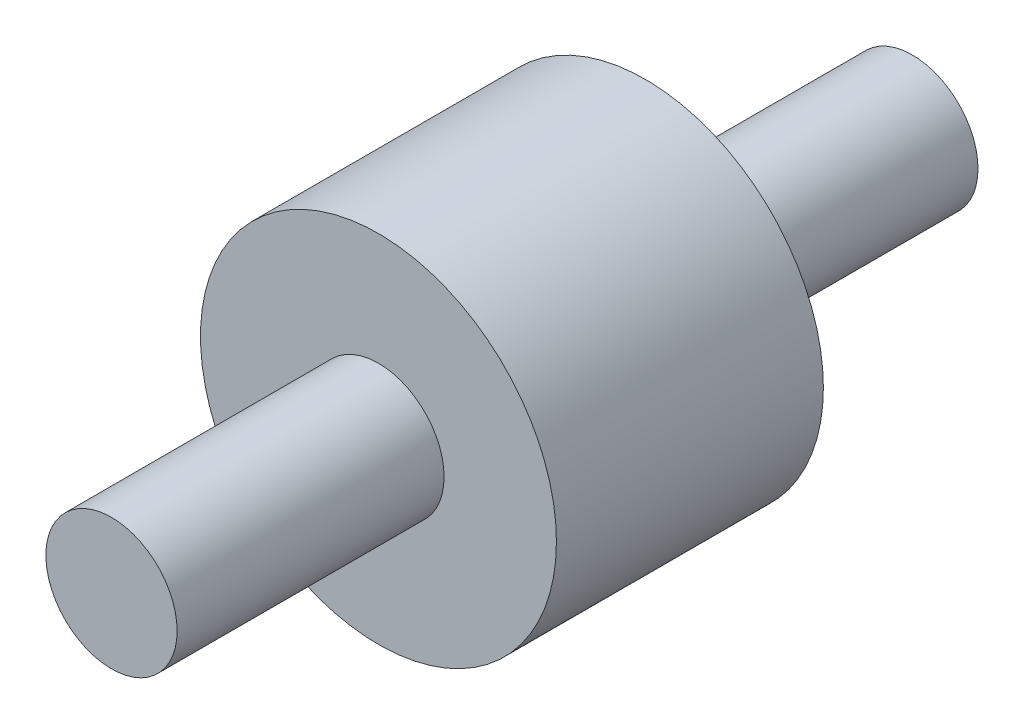
ISO-10303-21;
HEADER;
FILE_DESCRIPTION(('STEP AP214'),'2;1');
FILE_NAME('part.step','',(''),(''),'','','');
FILE_SCHEMA(('AUTOMOTIVE_DESIGN { 1 0 10303 214 1 1 1 1 }'));
ENDSEC;
DATA;
#1=APPLICATION_CONTEXT('core data for automotive mechanical design processes');
#2=APPLICATION_PROTOCOL_DEFINITION('international standard','automotive_design',2000,#1);
#3=PRODUCT_CONTEXT('',#1,'mechanical');
#4=PRODUCT('Part','Part','',(#3));
#5=PRODUCT_RELATED_PRODUCT_CATEGORY('part','',(#4));
#6=PRODUCT_DEFINITION_FORMATION('','',#4);
#7=PRODUCT_DEFINITION_CONTEXT('part definition',#1,'design');
#8=PRODUCT_DEFINITION('design','',#6,#7);
#9=PRODUCT_DEFINITION_SHAPE('','',#8);
#10=(LENGTH_UNIT() NAMED_UNIT(*) SI_UNIT(.MILLI.,.METRE.));
#11=(NAMED_UNIT(*) PLANE_ANGLE_UNIT() SI_UNIT($,.RADIAN.));
#12=(NAMED_UNIT(*) SI_UNIT($,.STERADIAN.) SOLID_ANGLE_UNIT());
#13=UNCERTAINTY_MEASURE_WITH_UNIT(LENGTH_MEASURE(1.E-05),#10,'distance_accuracy_value','');
#14=(GEOMETRIC_REPRESENTATION_CONTEXT(3) GLOBAL_UNCERTAINTY_ASSIGNED_CONTEXT((#13)) GLOBAL_UNIT_ASSIGNED_CONTEXT((#10,
#11,#12)) REPRESENTATION_CONTEXT('',''));
#15=CARTESIAN_POINT('',(0.,0.,0.));
#16=DIRECTION('',(0.,0.,1.));
#17=DIRECTION('',(1.,0.,0.));
#18=AXIS2_PLACEMENT_3D('',#15,#16,#17);
#19=CARTESIAN_POINT('',(0.,0.,6.));
#20=DIRECTION('',(0.,0.,-1.));
#21=DIRECTION('',(-1.,0.,0.));
#22=AXIS2_PLACEMENT_3D('',#19,#20,#21);
#23=CYLINDRICAL_SURFACE('',#22,8.);
#24=CARTESIAN_POINT('',(0.,0.,6.));
#25=DIRECTION('',(0.,0.,1.));
#26=DIRECTION('',(1.,0.,0.));
#27=AXIS2_PLACEMENT_3D('',#24,#25,#26);
#28=CIRCLE('',#27,8.);
#29=CARTESIAN_POINT('',(8.,0.,6.));
#30=VERTEX_POINT('',#29);
#31=EDGE_CURVE('E45',#30,#30,#28,.T.);
#32=ORIENTED_EDGE('',*,*,#31,.F.);
#33=EDGE_LOOP('',(#32));
#34=FACE_BOUND('',#33,.T.);
#35=CARTESIAN_POINT('',(0.,0.,-6.));
#36=DIRECTION('',(0.,0.,1.));
#37=DIRECTION('',(1.,0.,0.));
#38=AXIS2_PLACEMENT_3D('',#35,#36,#37);
#39=CIRCLE('',#38,8.);
#40=CARTESIAN_POINT('',(8.,0.,-6.));
#41=VERTEX_POINT('',#40);
#42=EDGE_CURVE('E40',#41,#41,#39,.T.);
#43=ORIENTED_EDGE('',*,*,#42,.T.);
#44=EDGE_LOOP('',(#43));
#45=FACE_BOUND('',#44,.T.);
#46=ADVANCED_FACE('F37',(#34,#45),#23,.T.);
#47=CARTESIAN_POINT('',(0.,0.,6.));
#48=DIRECTION('',(0.,0.,1.));
#49=DIRECTION('',(1.,0.,0.));
#50=AXIS2_PLACEMENT_3D('',#47,#48,#49);
#51=PLANE('',#50);
#52=CARTESIAN_POINT('',(0.,0.,6.));
#53=DIRECTION('',(0.,0.,1.));
#54=DIRECTION('',(1.,0.,0.));
#55=AXIS2_PLACEMENT_3D('',#52,#53,#54);
#56=CIRCLE('',#55,2.95);
#57=CARTESIAN_POINT('',(2.95,0.,6.));
#58=VERTEX_POINT('',#57);
#59=EDGE_CURVE('E10',#58,#58,#56,.T.);
#60=ORIENTED_EDGE('',*,*,#59,.F.);
#61=EDGE_LOOP('',(#60));
#62=FACE_BOUND('',#61,.T.);
#63=ORIENTED_EDGE('',*,*,#31,.T.);
#64=EDGE_LOOP('',(#63));
#65=FACE_BOUND('',#64,.T.);
#66=ADVANCED_FACE('F77',(#62,#65),#51,.T.);
#67=CARTESIAN_POINT('',(0.,0.,-6.));
#68=DIRECTION('',(0.,0.,1.));
#69=DIRECTION('',(1.,0.,0.));
#70=AXIS2_PLACEMENT_3D('',#67,#68,#69);
#71=PLANE('',#70);
#72=CARTESIAN_POINT('',(0.,0.,-6.));
#73=DIRECTION('',(0.,0.,1.));
#74=DIRECTION('',(1.,0.,0.));
#75=AXIS2_PLACEMENT_3D('',#72,#73,#74);
#76=CIRCLE('',#75,2.95);
#77=CARTESIAN_POINT('',(2.95,0.,-6.));
#78=VERTEX_POINT('',#77);
#79=EDGE_CURVE('E57',#78,#78,#76,.T.);
#80=ORIENTED_EDGE('',*,*,#79,.T.);
#81=EDGE_LOOP('',(#80));
#82=FACE_BOUND('',#81,.T.);
#83=ORIENTED_EDGE('',*,*,#42,.F.);
#84=EDGE_LOOP('',(#83));
#85=FACE_BOUND('',#84,.T.);
#86=ADVANCED_FACE('F82',(#82,#85),#71,.F.);
#87=CARTESIAN_POINT('',(0.,0.,18.));
#88=DIRECTION('',(0.,0.,-1.));
#89=DIRECTION('',(-1.,0.,0.));
#90=AXIS2_PLACEMENT_3D('',#87,#88,#89);
#91=CYLINDRICAL_SURFACE('',#90,2.95);
#92=CARTESIAN_POINT('',(0.,0.,18.));
#93=DIRECTION('',(0.,0.,1.));
#94=DIRECTION('',(1.,0.,0.));
#95=AXIS2_PLACEMENT_3D('',#92,#93,#94);
#96=CIRCLE('',#95,2.95);
#97=CARTESIAN_POINT('',(2.95,0.,18.));
#98=VERTEX_POINT('',#97);
#99=EDGE_CURVE('E52',#98,#98,#96,.T.);
#100=ORIENTED_EDGE('',*,*,#99,.F.);
#101=EDGE_LOOP('',(#100));
#102=FACE_BOUND('',#101,.T.);
#103=ORIENTED_EDGE('',*,*,#59,.T.);
#104=EDGE_LOOP('',(#103));
#105=FACE_BOUND('',#104,.T.);
#106=ADVANCED_FACE('F92',(#102,#105),#91,.T.);
#107=CARTESIAN_POINT('',(0.,0.,18.));
#108=DIRECTION('',(0.,0.,1.));
#109=DIRECTION('',(1.,0.,0.));
#110=AXIS2_PLACEMENT_3D('',#107,#108,#109);
#111=PLANE('',#110);
#112=ORIENTED_EDGE('',*,*,#99,.T.);
#113=EDGE_LOOP('',(#112));
#114=FACE_BOUND('',#113,.T.);
#115=ADVANCED_FACE('F74',(#114),#111,.T.);
#116=CARTESIAN_POINT('',(0.,0.,-18.));
#117=DIRECTION('',(0.,0.,1.));
#118=DIRECTION('',(1.,0.,0.));
#119=AXIS2_PLACEMENT_3D('',#116,#117,#118);
#120=CYLINDRICAL_SURFACE('',#119,2.95);
#121=CARTESIAN_POINT('',(0.,0.,-18.));
#122=DIRECTION('',(0.,0.,1.));
#123=DIRECTION('',(1.,0.,0.));
#124=AXIS2_PLACEMENT_3D('',#121,#122,#123);
#125=CIRCLE('',#124,2.95);
#126=CARTESIAN_POINT('',(2.95,0.,-18.));
#127=VERTEX_POINT('',#126);
#128=EDGE_CURVE('E56',#127,#127,#125,.T.);
#129=ORIENTED_EDGE('',*,*,#128,.T.);
#130=EDGE_LOOP('',(#129));
#131=FACE_BOUND('',#130,.T.);
#132=ORIENTED_EDGE('',*,*,#79,.F.);
#133=EDGE_LOOP('',(#132));
#134=FACE_BOUND('',#133,.T.);
#135=ADVANCED_FACE('F65',(#131,#134),#120,.T.);
#136=CARTESIAN_POINT('',(0.,0.,-18.));
#137=DIRECTION('',(0.,0.,-1.));
#138=DIRECTION('',(1.,0.,0.));
#139=AXIS2_PLACEMENT_3D('',#136,#137,#138);
#140=PLANE('',#139);
#141=ORIENTED_EDGE('',*,*,#128,.F.);
#142=EDGE_LOOP('',(#141));
#143=FACE_BOUND('',#142,.T.);
#144=ADVANCED_FACE('F68',(#143),#140,.T.);
#145=CLOSED_SHELL('',(#46,#66,#86,#106,#115,#135,#144));
#146=MANIFOLD_SOLID_BREP('B2',#145);
#147=ADVANCED_BREP_SHAPE_REPRESENTATION('',(#18,#146),#14);
#148=SHAPE_DEFINITION_REPRESENTATION(#9,#147);
ENDSEC;
END-ISO-10303-21;
